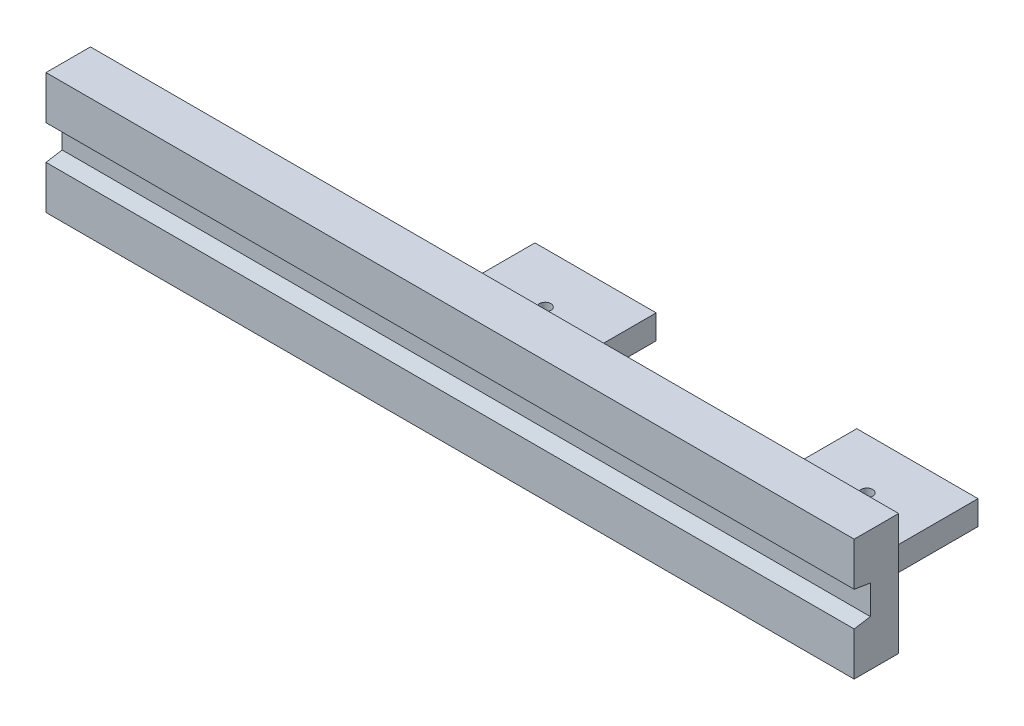
ISO-10303-21;
HEADER;
FILE_DESCRIPTION(('STEP AP214'),'2;1');
FILE_NAME('part.step','',(''),(''),'','','');
FILE_SCHEMA(('AUTOMOTIVE_DESIGN { 1 0 10303 214 1 1 1 1 }'));
ENDSEC;
DATA;
#1=APPLICATION_CONTEXT('core data for automotive mechanical design processes');
#2=APPLICATION_PROTOCOL_DEFINITION('international standard','automotive_design',2000,#1);
#3=PRODUCT_CONTEXT('',#1,'mechanical');
#4=PRODUCT('Part','Part','',(#3));
#5=PRODUCT_RELATED_PRODUCT_CATEGORY('part','',(#4));
#6=PRODUCT_DEFINITION_FORMATION('','',#4);
#7=PRODUCT_DEFINITION_CONTEXT('part definition',#1,'design');
#8=PRODUCT_DEFINITION('design','',#6,#7);
#9=PRODUCT_DEFINITION_SHAPE('','',#8);
#10=(LENGTH_UNIT() NAMED_UNIT(*) SI_UNIT(.MILLI.,.METRE.));
#11=(NAMED_UNIT(*) PLANE_ANGLE_UNIT() SI_UNIT($,.RADIAN.));
#12=(NAMED_UNIT(*) SI_UNIT($,.STERADIAN.) SOLID_ANGLE_UNIT());
#13=UNCERTAINTY_MEASURE_WITH_UNIT(LENGTH_MEASURE(1.E-05),#10,'distance_accuracy_value','');
#14=(GEOMETRIC_REPRESENTATION_CONTEXT(3) GLOBAL_UNCERTAINTY_ASSIGNED_CONTEXT((#13)) GLOBAL_UNIT_ASSIGNED_CONTEXT((#10,
#11,#12)) REPRESENTATION_CONTEXT('',''));
#15=CARTESIAN_POINT('',(0.,0.,0.));
#16=DIRECTION('',(0.,0.,1.));
#17=DIRECTION('',(1.,0.,0.));
#18=AXIS2_PLACEMENT_3D('',#15,#16,#17);
#19=CARTESIAN_POINT('',(0.,0.,0.));
#20=DIRECTION('',(0.,0.,1.));
#21=DIRECTION('',(1.,0.,0.));
#22=AXIS2_PLACEMENT_3D('',#19,#20,#21);
#23=PLANE('',#22);
#24=DIRECTION('',(0.,1.,0.));
#25=VECTOR('',#24,1.);
#26=CARTESIAN_POINT('',(85.,0.,0.));
#27=LINE('',#26,#25);
#28=CARTESIAN_POINT('',(85.,12.,0.));
#29=VERTEX_POINT('',#28);
#30=CARTESIAN_POINT('',(85.,18.,0.));
#31=VERTEX_POINT('',#30);
#32=EDGE_CURVE('E202',#29,#31,#27,.T.);
#33=ORIENTED_EDGE('',*,*,#32,.F.);
#34=DIRECTION('',(-1.,0.,0.));
#35=VECTOR('',#34,1.);
#36=CARTESIAN_POINT('',(0.,12.,0.));
#37=LINE('',#36,#35);
#38=CARTESIAN_POINT('',(115.,12.,0.));
#39=VERTEX_POINT('',#38);
#40=EDGE_CURVE('E211',#39,#29,#37,.T.);
#41=ORIENTED_EDGE('',*,*,#40,.F.);
#42=DIRECTION('',(0.,-1.,0.));
#43=VECTOR('',#42,1.);
#44=CARTESIAN_POINT('',(115.,0.,0.));
#45=LINE('',#44,#43);
#46=CARTESIAN_POINT('',(115.,18.,0.));
#47=VERTEX_POINT('',#46);
#48=EDGE_CURVE('E223',#47,#39,#45,.T.);
#49=ORIENTED_EDGE('',*,*,#48,.F.);
#50=DIRECTION('',(-1.,0.,0.));
#51=VECTOR('',#50,1.);
#52=CARTESIAN_POINT('',(0.,18.,0.));
#53=LINE('',#52,#51);
#54=EDGE_CURVE('E220',#47,#31,#53,.T.);
#55=ORIENTED_EDGE('',*,*,#54,.T.);
#56=EDGE_LOOP('',(#33,#41,#49,#55));
#57=FACE_BOUND('',#56,.T.);
#58=DIRECTION('',(0.,-1.,0.));
#59=VECTOR('',#58,1.);
#60=CARTESIAN_POINT('',(0.,30.,0.));
#61=LINE('',#60,#59);
#62=CARTESIAN_POINT('',(0.,30.,0.));
#63=VERTEX_POINT('',#62);
#64=CARTESIAN_POINT('',(0.,0.,0.));
#65=VERTEX_POINT('',#64);
#66=EDGE_CURVE('E236',#63,#65,#61,.T.);
#67=ORIENTED_EDGE('',*,*,#66,.F.);
#68=DIRECTION('',(-1.,0.,0.));
#69=VECTOR('',#68,1.);
#70=CARTESIAN_POINT('',(200.,30.,0.));
#71=LINE('',#70,#69);
#72=CARTESIAN_POINT('',(200.,30.,0.));
#73=VERTEX_POINT('',#72);
#74=EDGE_CURVE('E256',#73,#63,#71,.T.);
#75=ORIENTED_EDGE('',*,*,#74,.F.);
#76=DIRECTION('',(0.,1.,0.));
#77=VECTOR('',#76,1.);
#78=CARTESIAN_POINT('',(200.,0.,0.));
#79=LINE('',#78,#77);
#80=CARTESIAN_POINT('',(200.,0.,0.));
#81=VERTEX_POINT('',#80);
#82=EDGE_CURVE('E254',#81,#73,#79,.T.);
#83=ORIENTED_EDGE('',*,*,#82,.F.);
#84=DIRECTION('',(1.,0.,0.));
#85=VECTOR('',#84,1.);
#86=CARTESIAN_POINT('',(0.,0.,0.));
#87=LINE('',#86,#85);
#88=EDGE_CURVE('E252',#65,#81,#87,.T.);
#89=ORIENTED_EDGE('',*,*,#88,.F.);
#90=EDGE_LOOP('',(#67,#75,#83,#89));
#91=FACE_BOUND('',#90,.T.);
#92=DIRECTION('',(0.,1.,0.));
#93=VECTOR('',#92,1.);
#94=CARTESIAN_POINT('',(164.638936631344,18.,0.));
#95=LINE('',#94,#93);
#96=CARTESIAN_POINT('',(164.638936631344,12.,0.));
#97=VERTEX_POINT('',#96);
#98=CARTESIAN_POINT('',(164.638936631344,18.,0.));
#99=VERTEX_POINT('',#98);
#100=EDGE_CURVE('E170',#97,#99,#95,.T.);
#101=ORIENTED_EDGE('',*,*,#100,.F.);
#102=DIRECTION('',(-1.,0.,0.));
#103=VECTOR('',#102,1.);
#104=CARTESIAN_POINT('',(194.638936631344,12.,0.));
#105=LINE('',#104,#103);
#106=CARTESIAN_POINT('',(194.638936631344,12.,0.));
#107=VERTEX_POINT('',#106);
#108=EDGE_CURVE('E167',#107,#97,#105,.T.);
#109=ORIENTED_EDGE('',*,*,#108,.F.);
#110=DIRECTION('',(0.,-1.,0.));
#111=VECTOR('',#110,1.);
#112=CARTESIAN_POINT('',(194.638936631344,18.,0.));
#113=LINE('',#112,#111);
#114=CARTESIAN_POINT('',(194.638936631344,18.,0.));
#115=VERTEX_POINT('',#114);
#116=EDGE_CURVE('E57',#115,#107,#113,.T.);
#117=ORIENTED_EDGE('',*,*,#116,.F.);
#118=DIRECTION('',(1.,0.,0.));
#119=VECTOR('',#118,1.);
#120=CARTESIAN_POINT('',(194.638936631344,18.,0.));
#121=LINE('',#120,#119);
#122=EDGE_CURVE('E52',#99,#115,#121,.T.);
#123=ORIENTED_EDGE('',*,*,#122,.F.);
#124=EDGE_LOOP('',(#101,#109,#117,#123));
#125=FACE_BOUND('',#124,.T.);
#126=ADVANCED_FACE('F36',(#57,#91,#125),#23,.F.);
#127=CARTESIAN_POINT('',(0.,0.,11.));
#128=DIRECTION('',(0.,0.,1.));
#129=DIRECTION('',(1.,0.,0.));
#130=AXIS2_PLACEMENT_3D('',#127,#128,#129);
#131=PLANE('',#130);
#132=DIRECTION('',(0.,1.,0.));
#133=VECTOR('',#132,1.);
#134=CARTESIAN_POINT('',(200.,0.,11.));
#135=LINE('',#134,#133);
#136=CARTESIAN_POINT('',(200.,0.,11.));
#137=VERTEX_POINT('',#136);
#138=CARTESIAN_POINT('',(200.,10.75,11.));
#139=VERTEX_POINT('',#138);
#140=EDGE_CURVE('E244',#137,#139,#135,.T.);
#141=ORIENTED_EDGE('',*,*,#140,.T.);
#142=DIRECTION('',(1.,0.,0.));
#143=VECTOR('',#142,1.);
#144=CARTESIAN_POINT('',(0.,10.75,11.));
#145=LINE('',#144,#143);
#146=CARTESIAN_POINT('',(0.,10.75,11.));
#147=VERTEX_POINT('',#146);
#148=EDGE_CURVE('E192',#147,#139,#145,.T.);
#149=ORIENTED_EDGE('',*,*,#148,.F.);
#150=DIRECTION('',(0.,-1.,0.));
#151=VECTOR('',#150,1.);
#152=CARTESIAN_POINT('',(0.,30.,11.));
#153=LINE('',#152,#151);
#154=CARTESIAN_POINT('',(0.,0.,11.));
#155=VERTEX_POINT('',#154);
#156=EDGE_CURVE('E241',#147,#155,#153,.T.);
#157=ORIENTED_EDGE('',*,*,#156,.T.);
#158=DIRECTION('',(1.,0.,0.));
#159=VECTOR('',#158,1.);
#160=CARTESIAN_POINT('',(0.,0.,11.));
#161=LINE('',#160,#159);
#162=EDGE_CURVE('E240',#155,#137,#161,.T.);
#163=ORIENTED_EDGE('',*,*,#162,.T.);
#164=EDGE_LOOP('',(#141,#149,#157,#163));
#165=FACE_BOUND('',#164,.T.);
#166=ADVANCED_FACE('F299',(#165),#131,.T.);
#167=CARTESIAN_POINT('',(0.,30.,11.));
#168=DIRECTION('',(1.,0.,0.));
#169=DIRECTION('',(0.,1.,0.));
#170=AXIS2_PLACEMENT_3D('',#167,#168,#169);
#171=PLANE('',#170);
#172=DIRECTION('',(0.,1.,0.));
#173=VECTOR('',#172,1.);
#174=CARTESIAN_POINT('',(0.,0.,7.));
#175=LINE('',#174,#173);
#176=CARTESIAN_POINT('',(0.,11.4020395358431,7.));
#177=VERTEX_POINT('',#176);
#178=CARTESIAN_POINT('',(0.,18.6,7.));
#179=VERTEX_POINT('',#178);
#180=EDGE_CURVE('E185',#177,#179,#175,.T.);
#181=ORIENTED_EDGE('',*,*,#180,.T.);
#182=DIRECTION('',(0.,0.160396069376396,0.987052734623942));
#183=VECTOR('',#182,1.);
#184=CARTESIAN_POINT('',(0.,17.0132440249657,-2.76465215405702));
#185=LINE('',#184,#183);
#186=CARTESIAN_POINT('',(0.,19.25,11.));
#187=VERTEX_POINT('',#186);
#188=EDGE_CURVE('E189',#179,#187,#185,.T.);
#189=ORIENTED_EDGE('',*,*,#188,.T.);
#190=CARTESIAN_POINT('',(0.,30.,11.));
#191=VERTEX_POINT('',#190);
#192=EDGE_CURVE('E237',#191,#187,#153,.T.);
#193=ORIENTED_EDGE('',*,*,#192,.F.);
#194=DIRECTION('',(0.,0.,-1.));
#195=VECTOR('',#194,1.);
#196=CARTESIAN_POINT('',(0.,30.,11.));
#197=LINE('',#196,#195);
#198=EDGE_CURVE('E249',#191,#63,#197,.T.);
#199=ORIENTED_EDGE('',*,*,#198,.T.);
#200=ORIENTED_EDGE('',*,*,#66,.T.);
#201=DIRECTION('',(0.,0.,-1.));
#202=VECTOR('',#201,1.);
#203=CARTESIAN_POINT('',(0.,0.,11.));
#204=LINE('',#203,#202);
#205=EDGE_CURVE('E11',#155,#65,#204,.T.);
#206=ORIENTED_EDGE('',*,*,#205,.F.);
#207=ORIENTED_EDGE('',*,*,#156,.F.);
#208=DIRECTION('',(0.,-0.160886344412666,0.986972939943912));
#209=VECTOR('',#208,1.);
#210=CARTESIAN_POINT('',(0.,12.2184376817112,1.9917261086775));
#211=LINE('',#210,#209);
#212=EDGE_CURVE('E183',#177,#147,#211,.T.);
#213=ORIENTED_EDGE('',*,*,#212,.F.);
#214=EDGE_LOOP('',(#181,#189,#193,#199,#200,#206,#207,#213));
#215=FACE_BOUND('',#214,.T.);
#216=ADVANCED_FACE('F38',(#215),#171,.F.);
#217=CARTESIAN_POINT('',(0.,0.,11.));
#218=DIRECTION('',(0.,1.,0.));
#219=DIRECTION('',(0.,0.,1.));
#220=AXIS2_PLACEMENT_3D('',#217,#218,#219);
#221=PLANE('',#220);
#222=ORIENTED_EDGE('',*,*,#88,.T.);
#223=DIRECTION('',(0.,0.,-1.));
#224=VECTOR('',#223,1.);
#225=CARTESIAN_POINT('',(200.,0.,11.));
#226=LINE('',#225,#224);
#227=EDGE_CURVE('E45',#137,#81,#226,.T.);
#228=ORIENTED_EDGE('',*,*,#227,.F.);
#229=ORIENTED_EDGE('',*,*,#162,.F.);
#230=ORIENTED_EDGE('',*,*,#205,.T.);
#231=EDGE_LOOP('',(#222,#228,#229,#230));
#232=FACE_BOUND('',#231,.T.);
#233=ADVANCED_FACE('F301',(#232),#221,.F.);
#234=CARTESIAN_POINT('',(200.,0.,11.));
#235=DIRECTION('',(-1.,0.,0.));
#236=DIRECTION('',(0.,0.,1.));
#237=AXIS2_PLACEMENT_3D('',#234,#235,#236);
#238=PLANE('',#237);
#239=CARTESIAN_POINT('',(200.,19.25,11.));
#240=VERTEX_POINT('',#239);
#241=CARTESIAN_POINT('',(200.,30.,11.));
#242=VERTEX_POINT('',#241);
#243=EDGE_CURVE('E243',#240,#242,#135,.T.);
#244=ORIENTED_EDGE('',*,*,#243,.F.);
#245=DIRECTION('',(0.,0.160396069376396,0.987052734623942));
#246=VECTOR('',#245,1.);
#247=CARTESIAN_POINT('',(200.,17.0132440249657,-2.76465215405702));
#248=LINE('',#247,#246);
#249=CARTESIAN_POINT('',(200.,18.6,7.));
#250=VERTEX_POINT('',#249);
#251=EDGE_CURVE('E186',#250,#240,#248,.T.);
#252=ORIENTED_EDGE('',*,*,#251,.F.);
#253=DIRECTION('',(0.,1.,0.));
#254=VECTOR('',#253,1.);
#255=CARTESIAN_POINT('',(200.,0.,7.));
#256=LINE('',#255,#254);
#257=CARTESIAN_POINT('',(200.,11.4020395358431,7.));
#258=VERTEX_POINT('',#257);
#259=EDGE_CURVE('E195',#258,#250,#256,.T.);
#260=ORIENTED_EDGE('',*,*,#259,.F.);
#261=DIRECTION('',(0.,-0.160886344412666,0.986972939943912));
#262=VECTOR('',#261,1.);
#263=CARTESIAN_POINT('',(200.,12.2184376817112,1.9917261086775));
#264=LINE('',#263,#262);
#265=EDGE_CURVE('E182',#258,#139,#264,.T.);
#266=ORIENTED_EDGE('',*,*,#265,.T.);
#267=ORIENTED_EDGE('',*,*,#140,.F.);
#268=ORIENTED_EDGE('',*,*,#227,.T.);
#269=ORIENTED_EDGE('',*,*,#82,.T.);
#270=DIRECTION('',(0.,0.,-1.));
#271=VECTOR('',#270,1.);
#272=CARTESIAN_POINT('',(200.,30.,11.));
#273=LINE('',#272,#271);
#274=EDGE_CURVE('E260',#242,#73,#273,.T.);
#275=ORIENTED_EDGE('',*,*,#274,.F.);
#276=EDGE_LOOP('',(#244,#252,#260,#266,#267,#268,#269,#275));
#277=FACE_BOUND('',#276,.T.);
#278=ADVANCED_FACE('F269',(#277),#238,.F.);
#279=CARTESIAN_POINT('',(200.,30.,11.));
#280=DIRECTION('',(0.,-1.,0.));
#281=DIRECTION('',(1.,0.,0.));
#282=AXIS2_PLACEMENT_3D('',#279,#280,#281);
#283=PLANE('',#282);
#284=ORIENTED_EDGE('',*,*,#74,.T.);
#285=ORIENTED_EDGE('',*,*,#198,.F.);
#286=DIRECTION('',(-1.,0.,0.));
#287=VECTOR('',#286,1.);
#288=CARTESIAN_POINT('',(200.,30.,11.));
#289=LINE('',#288,#287);
#290=EDGE_CURVE('E247',#242,#191,#289,.T.);
#291=ORIENTED_EDGE('',*,*,#290,.F.);
#292=ORIENTED_EDGE('',*,*,#274,.T.);
#293=EDGE_LOOP('',(#284,#285,#291,#292));
#294=FACE_BOUND('',#293,.T.);
#295=ADVANCED_FACE('F278',(#294),#283,.F.);
#296=DIRECTION('',(1.,0.,0.));
#297=VECTOR('',#296,1.);
#298=CARTESIAN_POINT('',(0.,19.25,11.));
#299=LINE('',#298,#297);
#300=EDGE_CURVE('E199',#187,#240,#299,.T.);
#301=ORIENTED_EDGE('',*,*,#300,.T.);
#302=ORIENTED_EDGE('',*,*,#243,.T.);
#303=ORIENTED_EDGE('',*,*,#290,.T.);
#304=ORIENTED_EDGE('',*,*,#192,.T.);
#305=EDGE_LOOP('',(#301,#302,#303,#304));
#306=FACE_BOUND('',#305,.T.);
#307=ADVANCED_FACE('F285',(#306),#131,.T.);
#308=CARTESIAN_POINT('',(85.,0.,-25.));
#309=DIRECTION('',(1.,0.,0.));
#310=DIRECTION('',(0.,0.,-1.));
#311=AXIS2_PLACEMENT_3D('',#308,#309,#310);
#312=PLANE('',#311);
#313=ORIENTED_EDGE('',*,*,#32,.T.);
#314=DIRECTION('',(0.,0.,1.));
#315=VECTOR('',#314,1.);
#316=CARTESIAN_POINT('',(85.,18.,-25.));
#317=LINE('',#316,#315);
#318=CARTESIAN_POINT('',(85.,18.,-25.));
#319=VERTEX_POINT('',#318);
#320=EDGE_CURVE('E233',#319,#31,#317,.T.);
#321=ORIENTED_EDGE('',*,*,#320,.F.);
#322=DIRECTION('',(0.,1.,0.));
#323=VECTOR('',#322,1.);
#324=CARTESIAN_POINT('',(85.,0.,-25.));
#325=LINE('',#324,#323);
#326=CARTESIAN_POINT('',(85.,12.,-25.));
#327=VERTEX_POINT('',#326);
#328=EDGE_CURVE('E208',#327,#319,#325,.T.);
#329=ORIENTED_EDGE('',*,*,#328,.F.);
#330=DIRECTION('',(0.,0.,1.));
#331=VECTOR('',#330,1.);
#332=CARTESIAN_POINT('',(85.,12.,-25.));
#333=LINE('',#332,#331);
#334=EDGE_CURVE('E218',#327,#29,#333,.T.);
#335=ORIENTED_EDGE('',*,*,#334,.T.);
#336=EDGE_LOOP('',(#313,#321,#329,#335));
#337=FACE_BOUND('',#336,.T.);
#338=ADVANCED_FACE('F322',(#337),#312,.F.);
#339=CARTESIAN_POINT('',(0.,18.,-25.));
#340=DIRECTION('',(0.,1.,0.));
#341=DIRECTION('',(0.,0.,1.));
#342=AXIS2_PLACEMENT_3D('',#339,#340,#341);
#343=PLANE('',#342);
#344=CARTESIAN_POINT('',(100.,18.,-12.5));
#345=DIRECTION('',(0.,1.,0.));
#346=DIRECTION('',(0.,0.,1.));
#347=AXIS2_PLACEMENT_3D('',#344,#345,#346);
#348=CIRCLE('',#347,1.45);
#349=CARTESIAN_POINT('',(100.,18.,-11.05));
#350=VERTEX_POINT('',#349);
#351=EDGE_CURVE('E174',#350,#350,#348,.T.);
#352=ORIENTED_EDGE('',*,*,#351,.F.);
#353=EDGE_LOOP('',(#352));
#354=FACE_BOUND('',#353,.T.);
#355=ORIENTED_EDGE('',*,*,#54,.F.);
#356=DIRECTION('',(0.,0.,1.));
#357=VECTOR('',#356,1.);
#358=CARTESIAN_POINT('',(115.,18.,-25.));
#359=LINE('',#358,#357);
#360=CARTESIAN_POINT('',(115.,18.,-25.));
#361=VERTEX_POINT('',#360);
#362=EDGE_CURVE('E231',#361,#47,#359,.T.);
#363=ORIENTED_EDGE('',*,*,#362,.F.);
#364=DIRECTION('',(-1.,0.,0.));
#365=VECTOR('',#364,1.);
#366=CARTESIAN_POINT('',(0.,18.,-25.));
#367=LINE('',#366,#365);
#368=EDGE_CURVE('E210',#361,#319,#367,.T.);
#369=ORIENTED_EDGE('',*,*,#368,.T.);
#370=ORIENTED_EDGE('',*,*,#320,.T.);
#371=EDGE_LOOP('',(#355,#363,#369,#370));
#372=FACE_BOUND('',#371,.T.);
#373=ADVANCED_FACE('F326',(#354,#372),#343,.T.);
#374=CARTESIAN_POINT('',(115.,0.,-25.));
#375=DIRECTION('',(-1.,0.,0.));
#376=DIRECTION('',(0.,0.,1.));
#377=AXIS2_PLACEMENT_3D('',#374,#375,#376);
#378=PLANE('',#377);
#379=ORIENTED_EDGE('',*,*,#48,.T.);
#380=DIRECTION('',(0.,0.,1.));
#381=VECTOR('',#380,1.);
#382=CARTESIAN_POINT('',(115.,12.,-25.));
#383=LINE('',#382,#381);
#384=CARTESIAN_POINT('',(115.,12.,-25.));
#385=VERTEX_POINT('',#384);
#386=EDGE_CURVE('E228',#385,#39,#383,.T.);
#387=ORIENTED_EDGE('',*,*,#386,.F.);
#388=DIRECTION('',(0.,-1.,0.));
#389=VECTOR('',#388,1.);
#390=CARTESIAN_POINT('',(115.,0.,-25.));
#391=LINE('',#390,#389);
#392=EDGE_CURVE('E214',#361,#385,#391,.T.);
#393=ORIENTED_EDGE('',*,*,#392,.F.);
#394=ORIENTED_EDGE('',*,*,#362,.T.);
#395=EDGE_LOOP('',(#379,#387,#393,#394));
#396=FACE_BOUND('',#395,.T.);
#397=ADVANCED_FACE('F331',(#396),#378,.F.);
#398=CARTESIAN_POINT('',(0.,12.,-25.));
#399=DIRECTION('',(0.,1.,0.));
#400=DIRECTION('',(0.,0.,1.));
#401=AXIS2_PLACEMENT_3D('',#398,#399,#400);
#402=PLANE('',#401);
#403=CARTESIAN_POINT('',(100.,12.,-12.5));
#404=DIRECTION('',(0.,-1.,0.));
#405=DIRECTION('',(0.,0.,-1.));
#406=AXIS2_PLACEMENT_3D('',#403,#404,#405);
#407=CIRCLE('',#406,1.45);
#408=CARTESIAN_POINT('',(100.,12.,-13.95));
#409=VERTEX_POINT('',#408);
#410=EDGE_CURVE('E171',#409,#409,#407,.T.);
#411=ORIENTED_EDGE('',*,*,#410,.F.);
#412=EDGE_LOOP('',(#411));
#413=FACE_BOUND('',#412,.T.);
#414=ORIENTED_EDGE('',*,*,#40,.T.);
#415=ORIENTED_EDGE('',*,*,#334,.F.);
#416=DIRECTION('',(-1.,0.,0.));
#417=VECTOR('',#416,1.);
#418=CARTESIAN_POINT('',(0.,12.,-25.));
#419=LINE('',#418,#417);
#420=EDGE_CURVE('E216',#385,#327,#419,.T.);
#421=ORIENTED_EDGE('',*,*,#420,.F.);
#422=ORIENTED_EDGE('',*,*,#386,.T.);
#423=EDGE_LOOP('',(#414,#415,#421,#422));
#424=FACE_BOUND('',#423,.T.);
#425=ADVANCED_FACE('F337',(#413,#424),#402,.F.);
#426=CARTESIAN_POINT('',(0.,0.,-25.));
#427=DIRECTION('',(0.,0.,-1.));
#428=DIRECTION('',(-1.,0.,0.));
#429=AXIS2_PLACEMENT_3D('',#426,#427,#428);
#430=PLANE('',#429);
#431=ORIENTED_EDGE('',*,*,#328,.T.);
#432=ORIENTED_EDGE('',*,*,#368,.F.);
#433=ORIENTED_EDGE('',*,*,#392,.T.);
#434=ORIENTED_EDGE('',*,*,#420,.T.);
#435=EDGE_LOOP('',(#431,#432,#433,#434));
#436=FACE_BOUND('',#435,.T.);
#437=ADVANCED_FACE('F341',(#436),#430,.T.);
#438=CARTESIAN_POINT('',(0.,17.0132440249657,-2.76465215405702));
#439=DIRECTION('',(0.,0.987052734623942,-0.160396069376396));
#440=DIRECTION('',(0.,0.160396069376396,0.987052734623942));
#441=AXIS2_PLACEMENT_3D('',#438,#439,#440);
#442=PLANE('',#441);
#443=ORIENTED_EDGE('',*,*,#251,.T.);
#444=ORIENTED_EDGE('',*,*,#300,.F.);
#445=ORIENTED_EDGE('',*,*,#188,.F.);
#446=DIRECTION('',(1.,0.,0.));
#447=VECTOR('',#446,1.);
#448=CARTESIAN_POINT('',(0.,18.6,7.));
#449=LINE('',#448,#447);
#450=EDGE_CURVE('E203',#179,#250,#449,.T.);
#451=ORIENTED_EDGE('',*,*,#450,.T.);
#452=EDGE_LOOP('',(#443,#444,#445,#451));
#453=FACE_BOUND('',#452,.T.);
#454=ADVANCED_FACE('F289',(#453),#442,.F.);
#455=CARTESIAN_POINT('',(0.,0.,7.));
#456=DIRECTION('',(0.,0.,-1.));
#457=DIRECTION('',(-1.,0.,0.));
#458=AXIS2_PLACEMENT_3D('',#455,#456,#457);
#459=PLANE('',#458);
#460=ORIENTED_EDGE('',*,*,#259,.T.);
#461=ORIENTED_EDGE('',*,*,#450,.F.);
#462=ORIENTED_EDGE('',*,*,#180,.F.);
#463=DIRECTION('',(1.,0.,0.));
#464=VECTOR('',#463,1.);
#465=CARTESIAN_POINT('',(0.,11.4020395358431,7.));
#466=LINE('',#465,#464);
#467=EDGE_CURVE('E205',#177,#258,#466,.T.);
#468=ORIENTED_EDGE('',*,*,#467,.T.);
#469=EDGE_LOOP('',(#460,#461,#462,#468));
#470=FACE_BOUND('',#469,.T.);
#471=ADVANCED_FACE('F292',(#470),#459,.F.);
#472=CARTESIAN_POINT('',(0.,12.2184376817112,1.9917261086775));
#473=DIRECTION('',(0.,0.986972939943912,0.160886344412666));
#474=DIRECTION('',(0.,-0.160886344412666,0.986972939943912));
#475=AXIS2_PLACEMENT_3D('',#472,#473,#474);
#476=PLANE('',#475);
#477=ORIENTED_EDGE('',*,*,#265,.F.);
#478=ORIENTED_EDGE('',*,*,#467,.F.);
#479=ORIENTED_EDGE('',*,*,#212,.T.);
#480=ORIENTED_EDGE('',*,*,#148,.T.);
#481=EDGE_LOOP('',(#477,#478,#479,#480));
#482=FACE_BOUND('',#481,.T.);
#483=ADVANCED_FACE('F296',(#482),#476,.T.);
#484=CARTESIAN_POINT('',(100.,30.,-12.5));
#485=DIRECTION('',(0.,-1.,0.));
#486=DIRECTION('',(0.,0.,-1.));
#487=AXIS2_PLACEMENT_3D('',#484,#485,#486);
#488=CYLINDRICAL_SURFACE('',#487,1.45);
#489=ORIENTED_EDGE('',*,*,#351,.T.);
#490=EDGE_LOOP('',(#489));
#491=FACE_BOUND('',#490,.T.);
#492=ORIENTED_EDGE('',*,*,#410,.T.);
#493=EDGE_LOOP('',(#492));
#494=FACE_BOUND('',#493,.T.);
#495=ADVANCED_FACE('F348',(#491,#494),#488,.F.);
#496=CARTESIAN_POINT('',(164.638936631344,18.,-25.));
#497=DIRECTION('',(1.,0.,0.));
#498=DIRECTION('',(0.,0.,-1.));
#499=AXIS2_PLACEMENT_3D('',#496,#497,#498);
#500=PLANE('',#499);
#501=ORIENTED_EDGE('',*,*,#100,.T.);
#502=DIRECTION('',(0.,0.,1.));
#503=VECTOR('',#502,1.);
#504=CARTESIAN_POINT('',(164.638936631344,18.,-25.));
#505=LINE('',#504,#503);
#506=CARTESIAN_POINT('',(164.638936631344,18.,-25.));
#507=VERTEX_POINT('',#506);
#508=EDGE_CURVE('E151',#507,#99,#505,.T.);
#509=ORIENTED_EDGE('',*,*,#508,.F.);
#510=DIRECTION('',(0.,1.,0.));
#511=VECTOR('',#510,1.);
#512=CARTESIAN_POINT('',(164.638936631344,18.,-25.));
#513=LINE('',#512,#511);
#514=CARTESIAN_POINT('',(164.638936631344,12.,-25.));
#515=VERTEX_POINT('',#514);
#516=EDGE_CURVE('E158',#515,#507,#513,.T.);
#517=ORIENTED_EDGE('',*,*,#516,.F.);
#518=DIRECTION('',(0.,0.,1.));
#519=VECTOR('',#518,1.);
#520=CARTESIAN_POINT('',(164.638936631344,12.,-25.));
#521=LINE('',#520,#519);
#522=EDGE_CURVE('E386',#515,#97,#521,.T.);
#523=ORIENTED_EDGE('',*,*,#522,.T.);
#524=EDGE_LOOP('',(#501,#509,#517,#523));
#525=FACE_BOUND('',#524,.T.);
#526=ADVANCED_FACE('F169',(#525),#500,.F.);
#527=CARTESIAN_POINT('',(194.638936631344,18.,-25.));
#528=DIRECTION('',(0.,-1.,0.));
#529=DIRECTION('',(0.,0.,-1.));
#530=AXIS2_PLACEMENT_3D('',#527,#528,#529);
#531=PLANE('',#530);
#532=CARTESIAN_POINT('',(179.638936631344,18.,-12.5));
#533=DIRECTION('',(0.,1.,0.));
#534=DIRECTION('',(0.,0.,1.));
#535=AXIS2_PLACEMENT_3D('',#532,#533,#534);
#536=CIRCLE('',#535,1.45);
#537=CARTESIAN_POINT('',(179.638936631344,18.,-11.05));
#538=VERTEX_POINT('',#537);
#539=EDGE_CURVE('E379',#538,#538,#536,.T.);
#540=ORIENTED_EDGE('',*,*,#539,.F.);
#541=EDGE_LOOP('',(#540));
#542=FACE_BOUND('',#541,.T.);
#543=ORIENTED_EDGE('',*,*,#122,.T.);
#544=DIRECTION('',(0.,0.,1.));
#545=VECTOR('',#544,1.);
#546=CARTESIAN_POINT('',(194.638936631344,18.,-25.));
#547=LINE('',#546,#545);
#548=CARTESIAN_POINT('',(194.638936631344,18.,-25.));
#549=VERTEX_POINT('',#548);
#550=EDGE_CURVE('E154',#549,#115,#547,.T.);
#551=ORIENTED_EDGE('',*,*,#550,.F.);
#552=DIRECTION('',(1.,0.,0.));
#553=VECTOR('',#552,1.);
#554=CARTESIAN_POINT('',(194.638936631344,18.,-25.));
#555=LINE('',#554,#553);
#556=EDGE_CURVE('E147',#507,#549,#555,.T.);
#557=ORIENTED_EDGE('',*,*,#556,.F.);
#558=ORIENTED_EDGE('',*,*,#508,.T.);
#559=EDGE_LOOP('',(#543,#551,#557,#558));
#560=FACE_BOUND('',#559,.T.);
#561=ADVANCED_FACE('F149',(#542,#560),#531,.F.);
#562=CARTESIAN_POINT('',(194.638936631344,18.,-25.));
#563=DIRECTION('',(-1.,0.,0.));
#564=DIRECTION('',(0.,0.,1.));
#565=AXIS2_PLACEMENT_3D('',#562,#563,#564);
#566=PLANE('',#565);
#567=ORIENTED_EDGE('',*,*,#116,.T.);
#568=DIRECTION('',(0.,0.,1.));
#569=VECTOR('',#568,1.);
#570=CARTESIAN_POINT('',(194.638936631344,12.,-25.));
#571=LINE('',#570,#569);
#572=CARTESIAN_POINT('',(194.638936631344,12.,-25.));
#573=VERTEX_POINT('',#572);
#574=EDGE_CURVE('E176',#573,#107,#571,.T.);
#575=ORIENTED_EDGE('',*,*,#574,.F.);
#576=DIRECTION('',(0.,-1.,0.));
#577=VECTOR('',#576,1.);
#578=CARTESIAN_POINT('',(194.638936631344,18.,-25.));
#579=LINE('',#578,#577);
#580=EDGE_CURVE('E157',#549,#573,#579,.T.);
#581=ORIENTED_EDGE('',*,*,#580,.F.);
#582=ORIENTED_EDGE('',*,*,#550,.T.);
#583=EDGE_LOOP('',(#567,#575,#581,#582));
#584=FACE_BOUND('',#583,.T.);
#585=ADVANCED_FACE('F360',(#584),#566,.F.);
#586=CARTESIAN_POINT('',(194.638936631344,12.,-25.));
#587=DIRECTION('',(0.,1.,0.));
#588=DIRECTION('',(0.,0.,1.));
#589=AXIS2_PLACEMENT_3D('',#586,#587,#588);
#590=PLANE('',#589);
#591=CARTESIAN_POINT('',(179.638936631344,12.,-12.5));
#592=DIRECTION('',(0.,1.,0.));
#593=DIRECTION('',(0.,0.,1.));
#594=AXIS2_PLACEMENT_3D('',#591,#592,#593);
#595=CIRCLE('',#594,1.45);
#596=CARTESIAN_POINT('',(179.638936631344,12.,-11.05));
#597=VERTEX_POINT('',#596);
#598=EDGE_CURVE('E40',#597,#597,#595,.T.);
#599=ORIENTED_EDGE('',*,*,#598,.T.);
#600=EDGE_LOOP('',(#599));
#601=FACE_BOUND('',#600,.T.);
#602=ORIENTED_EDGE('',*,*,#108,.T.);
#603=ORIENTED_EDGE('',*,*,#522,.F.);
#604=DIRECTION('',(-1.,0.,0.));
#605=VECTOR('',#604,1.);
#606=CARTESIAN_POINT('',(194.638936631344,12.,-25.));
#607=LINE('',#606,#605);
#608=EDGE_CURVE('E163',#573,#515,#607,.T.);
#609=ORIENTED_EDGE('',*,*,#608,.F.);
#610=ORIENTED_EDGE('',*,*,#574,.T.);
#611=EDGE_LOOP('',(#602,#603,#609,#610));
#612=FACE_BOUND('',#611,.T.);
#613=ADVANCED_FACE('F364',(#601,#612),#590,.F.);
#614=CARTESIAN_POINT('',(0.,0.,-25.));
#615=DIRECTION('',(0.,0.,-1.));
#616=DIRECTION('',(-1.,0.,0.));
#617=AXIS2_PLACEMENT_3D('',#614,#615,#616);
#618=PLANE('',#617);
#619=ORIENTED_EDGE('',*,*,#516,.T.);
#620=ORIENTED_EDGE('',*,*,#556,.T.);
#621=ORIENTED_EDGE('',*,*,#580,.T.);
#622=ORIENTED_EDGE('',*,*,#608,.T.);
#623=EDGE_LOOP('',(#619,#620,#621,#622));
#624=FACE_BOUND('',#623,.T.);
#625=ADVANCED_FACE('F161',(#624),#618,.T.);
#626=CARTESIAN_POINT('',(179.638936631344,0.,-12.5));
#627=DIRECTION('',(0.,1.,0.));
#628=DIRECTION('',(0.,0.,1.));
#629=AXIS2_PLACEMENT_3D('',#626,#627,#628);
#630=CYLINDRICAL_SURFACE('',#629,1.45);
#631=ORIENTED_EDGE('',*,*,#539,.T.);
#632=EDGE_LOOP('',(#631));
#633=FACE_BOUND('',#632,.T.);
#634=ORIENTED_EDGE('',*,*,#598,.F.);
#635=EDGE_LOOP('',(#634));
#636=FACE_BOUND('',#635,.T.);
#637=ADVANCED_FACE('F371',(#633,#636),#630,.F.);
#638=CLOSED_SHELL('',(#126,#166,#216,#233,#278,#295,#307,#338,#373,#397,#425,#437,#454,#471,
#483,#495,#526,#561,#585,#613,#625,#637));
#639=MANIFOLD_SOLID_BREP('B2',#638);
#640=ADVANCED_BREP_SHAPE_REPRESENTATION('',(#18,#639),#14);
#641=SHAPE_DEFINITION_REPRESENTATION(#9,#640);
ENDSEC;
END-ISO-10303-21;
